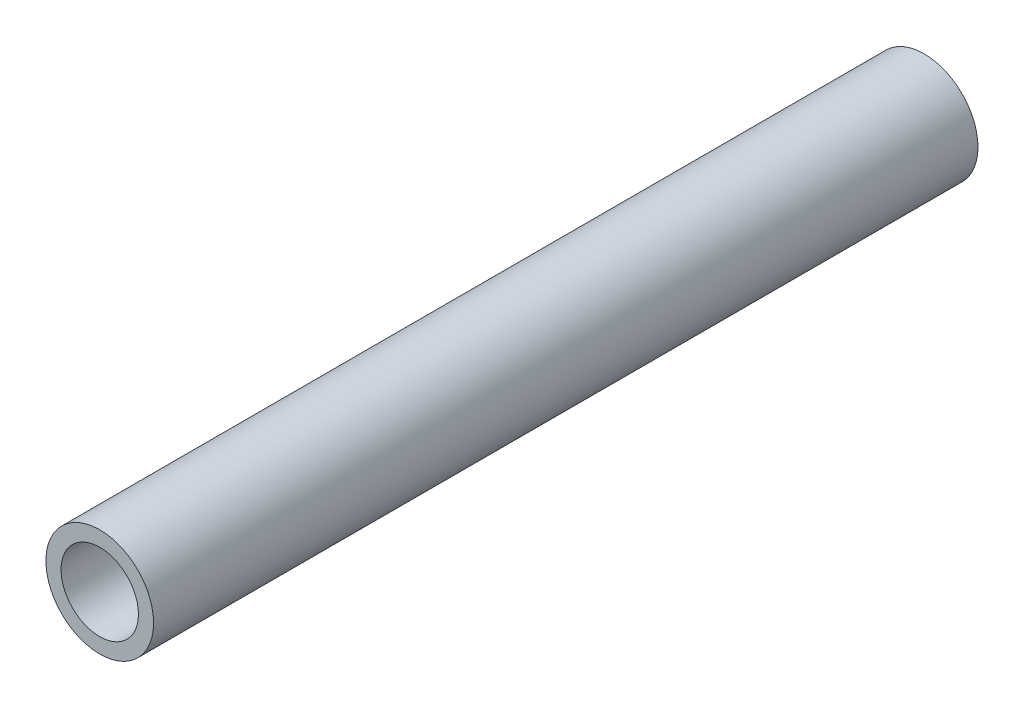
ISO-10303-21;
HEADER;
FILE_DESCRIPTION(('STEP AP214'),'2;1');
FILE_NAME('part.step','',(''),(''),'','','');
FILE_SCHEMA(('AUTOMOTIVE_DESIGN { 1 0 10303 214 1 1 1 1 }'));
ENDSEC;
DATA;
#1=APPLICATION_CONTEXT('core data for automotive mechanical design processes');
#2=APPLICATION_PROTOCOL_DEFINITION('international standard','automotive_design',2000,#1);
#3=PRODUCT_CONTEXT('',#1,'mechanical');
#4=PRODUCT('Part','Part','',(#3));
#5=PRODUCT_RELATED_PRODUCT_CATEGORY('part','',(#4));
#6=PRODUCT_DEFINITION_FORMATION('','',#4);
#7=PRODUCT_DEFINITION_CONTEXT('part definition',#1,'design');
#8=PRODUCT_DEFINITION('design','',#6,#7);
#9=PRODUCT_DEFINITION_SHAPE('','',#8);
#10=(LENGTH_UNIT() NAMED_UNIT(*) SI_UNIT(.MILLI.,.METRE.));
#11=(NAMED_UNIT(*) PLANE_ANGLE_UNIT() SI_UNIT($,.RADIAN.));
#12=(NAMED_UNIT(*) SI_UNIT($,.STERADIAN.) SOLID_ANGLE_UNIT());
#13=UNCERTAINTY_MEASURE_WITH_UNIT(LENGTH_MEASURE(1.E-05),#10,'distance_accuracy_value','');
#14=(GEOMETRIC_REPRESENTATION_CONTEXT(3) GLOBAL_UNCERTAINTY_ASSIGNED_CONTEXT((#13)) GLOBAL_UNIT_ASSIGNED_CONTEXT((#10,
#11,#12)) REPRESENTATION_CONTEXT('',''));
#15=CARTESIAN_POINT('',(0.,0.,0.));
#16=DIRECTION('',(0.,0.,1.));
#17=DIRECTION('',(1.,0.,0.));
#18=AXIS2_PLACEMENT_3D('',#15,#16,#17);
#19=CARTESIAN_POINT('',(0.,0.,49.));
#20=DIRECTION('',(0.,0.,1.));
#21=DIRECTION('',(1.,0.,0.));
#22=AXIS2_PLACEMENT_3D('',#19,#20,#21);
#23=PLANE('',#22);
#24=CARTESIAN_POINT('',(0.,0.,49.));
#25=DIRECTION('',(0.,0.,1.));
#26=DIRECTION('',(1.,0.,0.));
#27=AXIS2_PLACEMENT_3D('',#24,#25,#26);
#28=CIRCLE('',#27,3.2);
#29=CARTESIAN_POINT('',(3.2,0.,49.));
#30=VERTEX_POINT('',#29);
#31=EDGE_CURVE('E11',#30,#30,#28,.T.);
#32=ORIENTED_EDGE('',*,*,#31,.T.);
#33=EDGE_LOOP('',(#32));
#34=FACE_BOUND('',#33,.T.);
#35=CARTESIAN_POINT('',(0.,0.,49.));
#36=DIRECTION('',(0.,0.,1.));
#37=DIRECTION('',(1.,0.,0.));
#38=AXIS2_PLACEMENT_3D('',#35,#36,#37);
#39=CIRCLE('',#38,2.3);
#40=CARTESIAN_POINT('',(2.3,0.,49.));
#41=VERTEX_POINT('',#40);
#42=EDGE_CURVE('E48',#41,#41,#39,.T.);
#43=ORIENTED_EDGE('',*,*,#42,.F.);
#44=EDGE_LOOP('',(#43));
#45=FACE_BOUND('',#44,.T.);
#46=ADVANCED_FACE('F37',(#34,#45),#23,.T.);
#47=CARTESIAN_POINT('',(0.,0.,0.));
#48=DIRECTION('',(0.,0.,1.));
#49=DIRECTION('',(1.,0.,0.));
#50=AXIS2_PLACEMENT_3D('',#47,#48,#49);
#51=PLANE('',#50);
#52=CARTESIAN_POINT('',(0.,0.,0.));
#53=DIRECTION('',(0.,0.,1.));
#54=DIRECTION('',(1.,0.,0.));
#55=AXIS2_PLACEMENT_3D('',#52,#53,#54);
#56=CIRCLE('',#55,3.2);
#57=CARTESIAN_POINT('',(3.2,0.,0.));
#58=VERTEX_POINT('',#57);
#59=EDGE_CURVE('E41',#58,#58,#56,.T.);
#60=ORIENTED_EDGE('',*,*,#59,.F.);
#61=EDGE_LOOP('',(#60));
#62=FACE_BOUND('',#61,.T.);
#63=CARTESIAN_POINT('',(0.,0.,0.));
#64=DIRECTION('',(0.,0.,1.));
#65=DIRECTION('',(1.,0.,0.));
#66=AXIS2_PLACEMENT_3D('',#63,#64,#65);
#67=CIRCLE('',#66,2.3);
#68=CARTESIAN_POINT('',(2.3,0.,0.));
#69=VERTEX_POINT('',#68);
#70=EDGE_CURVE('E50',#69,#69,#67,.T.);
#71=ORIENTED_EDGE('',*,*,#70,.T.);
#72=EDGE_LOOP('',(#71));
#73=FACE_BOUND('',#72,.T.);
#74=ADVANCED_FACE('F60',(#62,#73),#51,.F.);
#75=CARTESIAN_POINT('',(0.,0.,49.));
#76=DIRECTION('',(0.,0.,-1.));
#77=DIRECTION('',(-1.,0.,0.));
#78=AXIS2_PLACEMENT_3D('',#75,#76,#77);
#79=CYLINDRICAL_SURFACE('',#78,3.2);
#80=ORIENTED_EDGE('',*,*,#31,.F.);
#81=EDGE_LOOP('',(#80));
#82=FACE_BOUND('',#81,.T.);
#83=ORIENTED_EDGE('',*,*,#59,.T.);
#84=EDGE_LOOP('',(#83));
#85=FACE_BOUND('',#84,.T.);
#86=ADVANCED_FACE('F39',(#82,#85),#79,.T.);
#87=CARTESIAN_POINT('',(0.,0.,49.));
#88=DIRECTION('',(0.,0.,-1.));
#89=DIRECTION('',(-1.,0.,0.));
#90=AXIS2_PLACEMENT_3D('',#87,#88,#89);
#91=CYLINDRICAL_SURFACE('',#90,2.3);
#92=ORIENTED_EDGE('',*,*,#42,.T.);
#93=EDGE_LOOP('',(#92));
#94=FACE_BOUND('',#93,.T.);
#95=ORIENTED_EDGE('',*,*,#70,.F.);
#96=EDGE_LOOP('',(#95));
#97=FACE_BOUND('',#96,.T.);
#98=ADVANCED_FACE('F56',(#94,#97),#91,.F.);
#99=CLOSED_SHELL('',(#46,#74,#86,#98));
#100=MANIFOLD_SOLID_BREP('B2',#99);
#101=ADVANCED_BREP_SHAPE_REPRESENTATION('',(#18,#100),#14);
#102=SHAPE_DEFINITION_REPRESENTATION(#9,#101);
ENDSEC;
END-ISO-10303-21;
